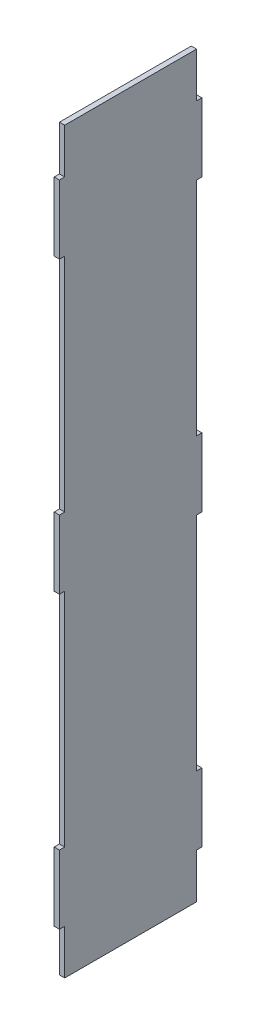
ISO-10303-21;
HEADER;
FILE_DESCRIPTION(('STEP AP214'),'2;1');
FILE_NAME('part.step','',(''),(''),'','','');
FILE_SCHEMA(('AUTOMOTIVE_DESIGN { 1 0 10303 214 1 1 1 1 }'));
ENDSEC;
DATA;
#1=APPLICATION_CONTEXT('core data for automotive mechanical design processes');
#2=APPLICATION_PROTOCOL_DEFINITION('international standard','automotive_design',2000,#1);
#3=PRODUCT_CONTEXT('',#1,'mechanical');
#4=PRODUCT('Part','Part','',(#3));
#5=PRODUCT_RELATED_PRODUCT_CATEGORY('part','',(#4));
#6=PRODUCT_DEFINITION_FORMATION('','',#4);
#7=PRODUCT_DEFINITION_CONTEXT('part definition',#1,'design');
#8=PRODUCT_DEFINITION('design','',#6,#7);
#9=PRODUCT_DEFINITION_SHAPE('','',#8);
#10=(LENGTH_UNIT() NAMED_UNIT(*) SI_UNIT(.MILLI.,.METRE.));
#11=(NAMED_UNIT(*) PLANE_ANGLE_UNIT() SI_UNIT($,.RADIAN.));
#12=(NAMED_UNIT(*) SI_UNIT($,.STERADIAN.) SOLID_ANGLE_UNIT());
#13=UNCERTAINTY_MEASURE_WITH_UNIT(LENGTH_MEASURE(1.E-05),#10,'distance_accuracy_value','');
#14=(GEOMETRIC_REPRESENTATION_CONTEXT(3) GLOBAL_UNCERTAINTY_ASSIGNED_CONTEXT((#13)) GLOBAL_UNIT_ASSIGNED_CONTEXT((#10,
#11,#12)) REPRESENTATION_CONTEXT('',''));
#15=CARTESIAN_POINT('',(0.,0.,0.));
#16=DIRECTION('',(0.,0.,1.));
#17=DIRECTION('',(1.,0.,0.));
#18=AXIS2_PLACEMENT_3D('',#15,#16,#17);
#19=CARTESIAN_POINT('',(1.,61.5,-12.5));
#20=DIRECTION('',(0.,0.,1.));
#21=DIRECTION('',(0.,-1.,0.));
#22=AXIS2_PLACEMENT_3D('',#19,#20,#21);
#23=PLANE('',#22);
#24=DIRECTION('',(0.,1.,0.));
#25=VECTOR('',#24,1.);
#26=CARTESIAN_POINT('',(0.,61.5,-12.5));
#27=LINE('',#26,#25);
#28=CARTESIAN_POINT('',(0.,61.5,-12.5));
#29=VERTEX_POINT('',#28);
#30=CARTESIAN_POINT('',(0.,70.,-12.5));
#31=VERTEX_POINT('',#30);
#32=EDGE_CURVE('E249',#29,#31,#27,.T.);
#33=ORIENTED_EDGE('',*,*,#32,.T.);
#34=DIRECTION('',(-1.,0.,0.));
#35=VECTOR('',#34,1.);
#36=CARTESIAN_POINT('',(1.,70.,-12.5));
#37=LINE('',#36,#35);
#38=CARTESIAN_POINT('',(1.,70.,-12.5));
#39=VERTEX_POINT('',#38);
#40=EDGE_CURVE('E11',#39,#31,#37,.T.);
#41=ORIENTED_EDGE('',*,*,#40,.F.);
#42=DIRECTION('',(0.,1.,0.));
#43=VECTOR('',#42,1.);
#44=CARTESIAN_POINT('',(1.,61.5,-12.5));
#45=LINE('',#44,#43);
#46=CARTESIAN_POINT('',(1.,61.5,-12.5));
#47=VERTEX_POINT('',#46);
#48=EDGE_CURVE('E303',#47,#39,#45,.T.);
#49=ORIENTED_EDGE('',*,*,#48,.F.);
#50=DIRECTION('',(-1.,0.,0.));
#51=VECTOR('',#50,1.);
#52=CARTESIAN_POINT('',(1.,61.5,-12.5));
#53=LINE('',#52,#51);
#54=EDGE_CURVE('E245',#47,#29,#53,.T.);
#55=ORIENTED_EDGE('',*,*,#54,.T.);
#56=EDGE_LOOP('',(#33,#41,#49,#55));
#57=FACE_BOUND('',#56,.T.);
#58=ADVANCED_FACE('F33',(#57),#23,.F.);
#59=CARTESIAN_POINT('',(1.,70.,12.5));
#60=DIRECTION('',(0.,-1.,0.));
#61=DIRECTION('',(0.,0.,-1.));
#62=AXIS2_PLACEMENT_3D('',#59,#60,#61);
#63=PLANE('',#62);
#64=DIRECTION('',(0.,0.,1.));
#65=VECTOR('',#64,1.);
#66=CARTESIAN_POINT('',(0.,70.,12.5));
#67=LINE('',#66,#65);
#68=CARTESIAN_POINT('',(0.,70.,12.5));
#69=VERTEX_POINT('',#68);
#70=EDGE_CURVE('E252',#31,#69,#67,.T.);
#71=ORIENTED_EDGE('',*,*,#70,.T.);
#72=DIRECTION('',(-1.,0.,0.));
#73=VECTOR('',#72,1.);
#74=CARTESIAN_POINT('',(1.,70.,12.5));
#75=LINE('',#74,#73);
#76=CARTESIAN_POINT('',(1.,70.,12.5));
#77=VERTEX_POINT('',#76);
#78=EDGE_CURVE('E41',#77,#69,#75,.T.);
#79=ORIENTED_EDGE('',*,*,#78,.F.);
#80=DIRECTION('',(0.,0.,1.));
#81=VECTOR('',#80,1.);
#82=CARTESIAN_POINT('',(1.,70.,12.5));
#83=LINE('',#82,#81);
#84=EDGE_CURVE('E152',#39,#77,#83,.T.);
#85=ORIENTED_EDGE('',*,*,#84,.F.);
#86=ORIENTED_EDGE('',*,*,#40,.T.);
#87=EDGE_LOOP('',(#71,#79,#85,#86));
#88=FACE_BOUND('',#87,.T.);
#89=ADVANCED_FACE('F461',(#88),#63,.F.);
#90=CARTESIAN_POINT('',(1.,61.5,12.5));
#91=DIRECTION('',(0.,0.,-1.));
#92=DIRECTION('',(-1.,0.,0.));
#93=AXIS2_PLACEMENT_3D('',#90,#91,#92);
#94=PLANE('',#93);
#95=DIRECTION('',(0.,-1.,0.));
#96=VECTOR('',#95,1.);
#97=CARTESIAN_POINT('',(0.,61.5,12.5));
#98=LINE('',#97,#96);
#99=CARTESIAN_POINT('',(0.,61.5,12.5));
#100=VERTEX_POINT('',#99);
#101=EDGE_CURVE('E254',#69,#100,#98,.T.);
#102=ORIENTED_EDGE('',*,*,#101,.T.);
#103=DIRECTION('',(-1.,0.,0.));
#104=VECTOR('',#103,1.);
#105=CARTESIAN_POINT('',(1.,61.5,12.5));
#106=LINE('',#105,#104);
#107=CARTESIAN_POINT('',(1.,61.5,12.5));
#108=VERTEX_POINT('',#107);
#109=EDGE_CURVE('E370',#108,#100,#106,.T.);
#110=ORIENTED_EDGE('',*,*,#109,.F.);
#111=DIRECTION('',(0.,-1.,0.));
#112=VECTOR('',#111,1.);
#113=CARTESIAN_POINT('',(1.,61.5,12.5));
#114=LINE('',#113,#112);
#115=EDGE_CURVE('E378',#77,#108,#114,.T.);
#116=ORIENTED_EDGE('',*,*,#115,.F.);
#117=ORIENTED_EDGE('',*,*,#78,.T.);
#118=EDGE_LOOP('',(#102,#110,#116,#117));
#119=FACE_BOUND('',#118,.T.);
#120=ADVANCED_FACE('F376',(#119),#94,.F.);
#121=CARTESIAN_POINT('',(1.,61.5,12.5));
#122=DIRECTION('',(0.,-1.,0.));
#123=DIRECTION('',(0.,0.,-1.));
#124=AXIS2_PLACEMENT_3D('',#121,#122,#123);
#125=PLANE('',#124);
#126=DIRECTION('',(0.,0.,1.));
#127=VECTOR('',#126,1.);
#128=CARTESIAN_POINT('',(0.,61.5,12.5));
#129=LINE('',#128,#127);
#130=CARTESIAN_POINT('',(0.,61.5,13.5));
#131=VERTEX_POINT('',#130);
#132=EDGE_CURVE('E256',#100,#131,#129,.T.);
#133=ORIENTED_EDGE('',*,*,#132,.T.);
#134=DIRECTION('',(-1.,0.,0.));
#135=VECTOR('',#134,1.);
#136=CARTESIAN_POINT('',(1.,61.5,13.5));
#137=LINE('',#136,#135);
#138=CARTESIAN_POINT('',(1.,61.5,13.5));
#139=VERTEX_POINT('',#138);
#140=EDGE_CURVE('E367',#139,#131,#137,.T.);
#141=ORIENTED_EDGE('',*,*,#140,.F.);
#142=DIRECTION('',(0.,0.,1.));
#143=VECTOR('',#142,1.);
#144=CARTESIAN_POINT('',(1.,61.5,12.5));
#145=LINE('',#144,#143);
#146=EDGE_CURVE('E396',#108,#139,#145,.T.);
#147=ORIENTED_EDGE('',*,*,#146,.F.);
#148=ORIENTED_EDGE('',*,*,#109,.T.);
#149=EDGE_LOOP('',(#133,#141,#147,#148));
#150=FACE_BOUND('',#149,.T.);
#151=ADVANCED_FACE('F387',(#150),#125,.F.);
#152=CARTESIAN_POINT('',(1.,61.5,13.5));
#153=DIRECTION('',(0.,0.,-1.));
#154=DIRECTION('',(-1.,0.,0.));
#155=AXIS2_PLACEMENT_3D('',#152,#153,#154);
#156=PLANE('',#155);
#157=DIRECTION('',(0.,-1.,0.));
#158=VECTOR('',#157,1.);
#159=CARTESIAN_POINT('',(0.,61.5,13.5));
#160=LINE('',#159,#158);
#161=CARTESIAN_POINT('',(0.,48.5,13.5));
#162=VERTEX_POINT('',#161);
#163=EDGE_CURVE('E258',#131,#162,#160,.T.);
#164=ORIENTED_EDGE('',*,*,#163,.T.);
#165=DIRECTION('',(-1.,0.,0.));
#166=VECTOR('',#165,1.);
#167=CARTESIAN_POINT('',(1.,48.5,13.5));
#168=LINE('',#167,#166);
#169=CARTESIAN_POINT('',(1.,48.5,13.5));
#170=VERTEX_POINT('',#169);
#171=EDGE_CURVE('E364',#170,#162,#168,.T.);
#172=ORIENTED_EDGE('',*,*,#171,.F.);
#173=DIRECTION('',(0.,-1.,0.));
#174=VECTOR('',#173,1.);
#175=CARTESIAN_POINT('',(1.,61.5,13.5));
#176=LINE('',#175,#174);
#177=EDGE_CURVE('E393',#139,#170,#176,.T.);
#178=ORIENTED_EDGE('',*,*,#177,.F.);
#179=ORIENTED_EDGE('',*,*,#140,.T.);
#180=EDGE_LOOP('',(#164,#172,#178,#179));
#181=FACE_BOUND('',#180,.T.);
#182=ADVANCED_FACE('F391',(#181),#156,.F.);
#183=CARTESIAN_POINT('',(1.,48.5,13.5));
#184=DIRECTION('',(0.,1.,0.));
#185=DIRECTION('',(0.,0.,1.));
#186=AXIS2_PLACEMENT_3D('',#183,#184,#185);
#187=PLANE('',#186);
#188=DIRECTION('',(0.,0.,-1.));
#189=VECTOR('',#188,1.);
#190=CARTESIAN_POINT('',(0.,48.5,13.5));
#191=LINE('',#190,#189);
#192=CARTESIAN_POINT('',(0.,48.5,12.5));
#193=VERTEX_POINT('',#192);
#194=EDGE_CURVE('E260',#162,#193,#191,.T.);
#195=ORIENTED_EDGE('',*,*,#194,.T.);
#196=DIRECTION('',(-1.,0.,0.));
#197=VECTOR('',#196,1.);
#198=CARTESIAN_POINT('',(1.,48.5,12.5));
#199=LINE('',#198,#197);
#200=CARTESIAN_POINT('',(1.,48.5,12.5));
#201=VERTEX_POINT('',#200);
#202=EDGE_CURVE('E361',#201,#193,#199,.T.);
#203=ORIENTED_EDGE('',*,*,#202,.F.);
#204=DIRECTION('',(0.,0.,-1.));
#205=VECTOR('',#204,1.);
#206=CARTESIAN_POINT('',(1.,48.5,13.5));
#207=LINE('',#206,#205);
#208=EDGE_CURVE('E395',#170,#201,#207,.T.);
#209=ORIENTED_EDGE('',*,*,#208,.F.);
#210=ORIENTED_EDGE('',*,*,#171,.T.);
#211=EDGE_LOOP('',(#195,#203,#209,#210));
#212=FACE_BOUND('',#211,.T.);
#213=ADVANCED_FACE('F474',(#212),#187,.F.);
#214=CARTESIAN_POINT('',(1.,48.5,12.5));
#215=DIRECTION('',(0.,0.,-1.));
#216=DIRECTION('',(-1.,0.,0.));
#217=AXIS2_PLACEMENT_3D('',#214,#215,#216);
#218=PLANE('',#217);
#219=DIRECTION('',(0.,-1.,0.));
#220=VECTOR('',#219,1.);
#221=CARTESIAN_POINT('',(0.,48.5,12.5));
#222=LINE('',#221,#220);
#223=CARTESIAN_POINT('',(0.,6.5,12.5));
#224=VERTEX_POINT('',#223);
#225=EDGE_CURVE('E262',#193,#224,#222,.T.);
#226=ORIENTED_EDGE('',*,*,#225,.T.);
#227=DIRECTION('',(-1.,0.,0.));
#228=VECTOR('',#227,1.);
#229=CARTESIAN_POINT('',(1.,6.5,12.5));
#230=LINE('',#229,#228);
#231=CARTESIAN_POINT('',(1.,6.5,12.5));
#232=VERTEX_POINT('',#231);
#233=EDGE_CURVE('E358',#232,#224,#230,.T.);
#234=ORIENTED_EDGE('',*,*,#233,.F.);
#235=DIRECTION('',(0.,-1.,0.));
#236=VECTOR('',#235,1.);
#237=CARTESIAN_POINT('',(1.,48.5,12.5));
#238=LINE('',#237,#236);
#239=EDGE_CURVE('E398',#201,#232,#238,.T.);
#240=ORIENTED_EDGE('',*,*,#239,.F.);
#241=ORIENTED_EDGE('',*,*,#202,.T.);
#242=EDGE_LOOP('',(#226,#234,#240,#241));
#243=FACE_BOUND('',#242,.T.);
#244=ADVANCED_FACE('F477',(#243),#218,.F.);
#245=CARTESIAN_POINT('',(1.,6.5,12.5));
#246=DIRECTION('',(0.,-1.,0.));
#247=DIRECTION('',(0.,0.,-1.));
#248=AXIS2_PLACEMENT_3D('',#245,#246,#247);
#249=PLANE('',#248);
#250=DIRECTION('',(0.,0.,1.));
#251=VECTOR('',#250,1.);
#252=CARTESIAN_POINT('',(0.,6.5,12.5));
#253=LINE('',#252,#251);
#254=CARTESIAN_POINT('',(0.,6.5,13.5));
#255=VERTEX_POINT('',#254);
#256=EDGE_CURVE('E264',#224,#255,#253,.T.);
#257=ORIENTED_EDGE('',*,*,#256,.T.);
#258=DIRECTION('',(-1.,0.,0.));
#259=VECTOR('',#258,1.);
#260=CARTESIAN_POINT('',(1.,6.5,13.5));
#261=LINE('',#260,#259);
#262=CARTESIAN_POINT('',(1.,6.5,13.5));
#263=VERTEX_POINT('',#262);
#264=EDGE_CURVE('E355',#263,#255,#261,.T.);
#265=ORIENTED_EDGE('',*,*,#264,.F.);
#266=DIRECTION('',(0.,0.,1.));
#267=VECTOR('',#266,1.);
#268=CARTESIAN_POINT('',(1.,6.5,12.5));
#269=LINE('',#268,#267);
#270=EDGE_CURVE('E404',#232,#263,#269,.T.);
#271=ORIENTED_EDGE('',*,*,#270,.F.);
#272=ORIENTED_EDGE('',*,*,#233,.T.);
#273=EDGE_LOOP('',(#257,#265,#271,#272));
#274=FACE_BOUND('',#273,.T.);
#275=ADVANCED_FACE('F481',(#274),#249,.F.);
#276=CARTESIAN_POINT('',(1.,6.5,13.5));
#277=DIRECTION('',(0.,0.,-1.));
#278=DIRECTION('',(-1.,0.,0.));
#279=AXIS2_PLACEMENT_3D('',#276,#277,#278);
#280=PLANE('',#279);
#281=DIRECTION('',(0.,-1.,0.));
#282=VECTOR('',#281,1.);
#283=CARTESIAN_POINT('',(0.,6.5,13.5));
#284=LINE('',#283,#282);
#285=CARTESIAN_POINT('',(0.,-6.5,13.5));
#286=VERTEX_POINT('',#285);
#287=EDGE_CURVE('E266',#255,#286,#284,.T.);
#288=ORIENTED_EDGE('',*,*,#287,.T.);
#289=DIRECTION('',(-1.,0.,0.));
#290=VECTOR('',#289,1.);
#291=CARTESIAN_POINT('',(1.,-6.5,13.5));
#292=LINE('',#291,#290);
#293=CARTESIAN_POINT('',(1.,-6.5,13.5));
#294=VERTEX_POINT('',#293);
#295=EDGE_CURVE('E352',#294,#286,#292,.T.);
#296=ORIENTED_EDGE('',*,*,#295,.F.);
#297=DIRECTION('',(0.,-1.,0.));
#298=VECTOR('',#297,1.);
#299=CARTESIAN_POINT('',(1.,6.5,13.5));
#300=LINE('',#299,#298);
#301=EDGE_CURVE('E406',#263,#294,#300,.T.);
#302=ORIENTED_EDGE('',*,*,#301,.F.);
#303=ORIENTED_EDGE('',*,*,#264,.T.);
#304=EDGE_LOOP('',(#288,#296,#302,#303));
#305=FACE_BOUND('',#304,.T.);
#306=ADVANCED_FACE('F485',(#305),#280,.F.);
#307=CARTESIAN_POINT('',(1.,-6.5,13.5));
#308=DIRECTION('',(0.,1.,0.));
#309=DIRECTION('',(0.,0.,1.));
#310=AXIS2_PLACEMENT_3D('',#307,#308,#309);
#311=PLANE('',#310);
#312=DIRECTION('',(0.,0.,-1.));
#313=VECTOR('',#312,1.);
#314=CARTESIAN_POINT('',(0.,-6.5,13.5));
#315=LINE('',#314,#313);
#316=CARTESIAN_POINT('',(0.,-6.5,12.5));
#317=VERTEX_POINT('',#316);
#318=EDGE_CURVE('E268',#286,#317,#315,.T.);
#319=ORIENTED_EDGE('',*,*,#318,.T.);
#320=DIRECTION('',(-1.,0.,0.));
#321=VECTOR('',#320,1.);
#322=CARTESIAN_POINT('',(1.,-6.5,12.5));
#323=LINE('',#322,#321);
#324=CARTESIAN_POINT('',(1.,-6.5,12.5));
#325=VERTEX_POINT('',#324);
#326=EDGE_CURVE('E349',#325,#317,#323,.T.);
#327=ORIENTED_EDGE('',*,*,#326,.F.);
#328=DIRECTION('',(0.,0.,-1.));
#329=VECTOR('',#328,1.);
#330=CARTESIAN_POINT('',(1.,-6.5,13.5));
#331=LINE('',#330,#329);
#332=EDGE_CURVE('E408',#294,#325,#331,.T.);
#333=ORIENTED_EDGE('',*,*,#332,.F.);
#334=ORIENTED_EDGE('',*,*,#295,.T.);
#335=EDGE_LOOP('',(#319,#327,#333,#334));
#336=FACE_BOUND('',#335,.T.);
#337=ADVANCED_FACE('F489',(#336),#311,.F.);
#338=CARTESIAN_POINT('',(1.,-6.5,12.5));
#339=DIRECTION('',(0.,0.,-1.));
#340=DIRECTION('',(-1.,0.,0.));
#341=AXIS2_PLACEMENT_3D('',#338,#339,#340);
#342=PLANE('',#341);
#343=DIRECTION('',(0.,-1.,0.));
#344=VECTOR('',#343,1.);
#345=CARTESIAN_POINT('',(0.,-6.5,12.5));
#346=LINE('',#345,#344);
#347=CARTESIAN_POINT('',(0.,-48.5,12.5));
#348=VERTEX_POINT('',#347);
#349=EDGE_CURVE('E270',#317,#348,#346,.T.);
#350=ORIENTED_EDGE('',*,*,#349,.T.);
#351=DIRECTION('',(-1.,0.,0.));
#352=VECTOR('',#351,1.);
#353=CARTESIAN_POINT('',(1.,-48.5,12.5));
#354=LINE('',#353,#352);
#355=CARTESIAN_POINT('',(1.,-48.5,12.5));
#356=VERTEX_POINT('',#355);
#357=EDGE_CURVE('E346',#356,#348,#354,.T.);
#358=ORIENTED_EDGE('',*,*,#357,.F.);
#359=DIRECTION('',(0.,-1.,0.));
#360=VECTOR('',#359,1.);
#361=CARTESIAN_POINT('',(1.,-6.5,12.5));
#362=LINE('',#361,#360);
#363=EDGE_CURVE('E410',#325,#356,#362,.T.);
#364=ORIENTED_EDGE('',*,*,#363,.F.);
#365=ORIENTED_EDGE('',*,*,#326,.T.);
#366=EDGE_LOOP('',(#350,#358,#364,#365));
#367=FACE_BOUND('',#366,.T.);
#368=ADVANCED_FACE('F493',(#367),#342,.F.);
#369=CARTESIAN_POINT('',(1.,-48.5,12.5));
#370=DIRECTION('',(0.,-1.,0.));
#371=DIRECTION('',(0.,0.,-1.));
#372=AXIS2_PLACEMENT_3D('',#369,#370,#371);
#373=PLANE('',#372);
#374=DIRECTION('',(0.,0.,1.));
#375=VECTOR('',#374,1.);
#376=CARTESIAN_POINT('',(0.,-48.5,12.5));
#377=LINE('',#376,#375);
#378=CARTESIAN_POINT('',(0.,-48.5,13.5));
#379=VERTEX_POINT('',#378);
#380=EDGE_CURVE('E272',#348,#379,#377,.T.);
#381=ORIENTED_EDGE('',*,*,#380,.T.);
#382=DIRECTION('',(-1.,0.,0.));
#383=VECTOR('',#382,1.);
#384=CARTESIAN_POINT('',(1.,-48.5,13.5));
#385=LINE('',#384,#383);
#386=CARTESIAN_POINT('',(1.,-48.5,13.5));
#387=VERTEX_POINT('',#386);
#388=EDGE_CURVE('E343',#387,#379,#385,.T.);
#389=ORIENTED_EDGE('',*,*,#388,.F.);
#390=DIRECTION('',(0.,0.,1.));
#391=VECTOR('',#390,1.);
#392=CARTESIAN_POINT('',(1.,-48.5,12.5));
#393=LINE('',#392,#391);
#394=EDGE_CURVE('E412',#356,#387,#393,.T.);
#395=ORIENTED_EDGE('',*,*,#394,.F.);
#396=ORIENTED_EDGE('',*,*,#357,.T.);
#397=EDGE_LOOP('',(#381,#389,#395,#396));
#398=FACE_BOUND('',#397,.T.);
#399=ADVANCED_FACE('F497',(#398),#373,.F.);
#400=CARTESIAN_POINT('',(1.,-48.5,13.5));
#401=DIRECTION('',(0.,0.,-1.));
#402=DIRECTION('',(-1.,0.,0.));
#403=AXIS2_PLACEMENT_3D('',#400,#401,#402);
#404=PLANE('',#403);
#405=DIRECTION('',(0.,-1.,0.));
#406=VECTOR('',#405,1.);
#407=CARTESIAN_POINT('',(0.,-48.5,13.5));
#408=LINE('',#407,#406);
#409=CARTESIAN_POINT('',(0.,-61.5,13.5));
#410=VERTEX_POINT('',#409);
#411=EDGE_CURVE('E274',#379,#410,#408,.T.);
#412=ORIENTED_EDGE('',*,*,#411,.T.);
#413=DIRECTION('',(-1.,0.,0.));
#414=VECTOR('',#413,1.);
#415=CARTESIAN_POINT('',(1.,-61.5,13.5));
#416=LINE('',#415,#414);
#417=CARTESIAN_POINT('',(1.,-61.5,13.5));
#418=VERTEX_POINT('',#417);
#419=EDGE_CURVE('E340',#418,#410,#416,.T.);
#420=ORIENTED_EDGE('',*,*,#419,.F.);
#421=DIRECTION('',(0.,-1.,0.));
#422=VECTOR('',#421,1.);
#423=CARTESIAN_POINT('',(1.,-48.5,13.5));
#424=LINE('',#423,#422);
#425=EDGE_CURVE('E414',#387,#418,#424,.T.);
#426=ORIENTED_EDGE('',*,*,#425,.F.);
#427=ORIENTED_EDGE('',*,*,#388,.T.);
#428=EDGE_LOOP('',(#412,#420,#426,#427));
#429=FACE_BOUND('',#428,.T.);
#430=ADVANCED_FACE('F501',(#429),#404,.F.);
#431=CARTESIAN_POINT('',(1.,-61.5,13.5));
#432=DIRECTION('',(0.,1.,0.));
#433=DIRECTION('',(0.,0.,1.));
#434=AXIS2_PLACEMENT_3D('',#431,#432,#433);
#435=PLANE('',#434);
#436=DIRECTION('',(0.,0.,-1.));
#437=VECTOR('',#436,1.);
#438=CARTESIAN_POINT('',(0.,-61.5,13.5));
#439=LINE('',#438,#437);
#440=CARTESIAN_POINT('',(0.,-61.5,12.5));
#441=VERTEX_POINT('',#440);
#442=EDGE_CURVE('E276',#410,#441,#439,.T.);
#443=ORIENTED_EDGE('',*,*,#442,.T.);
#444=DIRECTION('',(-1.,0.,0.));
#445=VECTOR('',#444,1.);
#446=CARTESIAN_POINT('',(1.,-61.5,12.5));
#447=LINE('',#446,#445);
#448=CARTESIAN_POINT('',(1.,-61.5,12.5));
#449=VERTEX_POINT('',#448);
#450=EDGE_CURVE('E337',#449,#441,#447,.T.);
#451=ORIENTED_EDGE('',*,*,#450,.F.);
#452=DIRECTION('',(0.,0.,-1.));
#453=VECTOR('',#452,1.);
#454=CARTESIAN_POINT('',(1.,-61.5,13.5));
#455=LINE('',#454,#453);
#456=EDGE_CURVE('E416',#418,#449,#455,.T.);
#457=ORIENTED_EDGE('',*,*,#456,.F.);
#458=ORIENTED_EDGE('',*,*,#419,.T.);
#459=EDGE_LOOP('',(#443,#451,#457,#458));
#460=FACE_BOUND('',#459,.T.);
#461=ADVANCED_FACE('F505',(#460),#435,.F.);
#462=CARTESIAN_POINT('',(1.,-61.5,12.5));
#463=DIRECTION('',(0.,0.,-1.));
#464=DIRECTION('',(-1.,0.,0.));
#465=AXIS2_PLACEMENT_3D('',#462,#463,#464);
#466=PLANE('',#465);
#467=DIRECTION('',(0.,-1.,0.));
#468=VECTOR('',#467,1.);
#469=CARTESIAN_POINT('',(0.,-61.5,12.5));
#470=LINE('',#469,#468);
#471=CARTESIAN_POINT('',(0.,-70.,12.5));
#472=VERTEX_POINT('',#471);
#473=EDGE_CURVE('E278',#441,#472,#470,.T.);
#474=ORIENTED_EDGE('',*,*,#473,.T.);
#475=DIRECTION('',(-1.,0.,0.));
#476=VECTOR('',#475,1.);
#477=CARTESIAN_POINT('',(1.,-70.,12.5));
#478=LINE('',#477,#476);
#479=CARTESIAN_POINT('',(1.,-70.,12.5));
#480=VERTEX_POINT('',#479);
#481=EDGE_CURVE('E334',#480,#472,#478,.T.);
#482=ORIENTED_EDGE('',*,*,#481,.F.);
#483=DIRECTION('',(0.,-1.,0.));
#484=VECTOR('',#483,1.);
#485=CARTESIAN_POINT('',(1.,-61.5,12.5));
#486=LINE('',#485,#484);
#487=EDGE_CURVE('E418',#449,#480,#486,.T.);
#488=ORIENTED_EDGE('',*,*,#487,.F.);
#489=ORIENTED_EDGE('',*,*,#450,.T.);
#490=EDGE_LOOP('',(#474,#482,#488,#489));
#491=FACE_BOUND('',#490,.T.);
#492=ADVANCED_FACE('F509',(#491),#466,.F.);
#493=CARTESIAN_POINT('',(1.,-70.,12.5));
#494=DIRECTION('',(0.,1.,0.));
#495=DIRECTION('',(0.,0.,1.));
#496=AXIS2_PLACEMENT_3D('',#493,#494,#495);
#497=PLANE('',#496);
#498=DIRECTION('',(0.,0.,-1.));
#499=VECTOR('',#498,1.);
#500=CARTESIAN_POINT('',(0.,-70.,12.5));
#501=LINE('',#500,#499);
#502=CARTESIAN_POINT('',(0.,-70.,-12.5));
#503=VERTEX_POINT('',#502);
#504=EDGE_CURVE('E280',#472,#503,#501,.T.);
#505=ORIENTED_EDGE('',*,*,#504,.T.);
#506=DIRECTION('',(-1.,0.,0.));
#507=VECTOR('',#506,1.);
#508=CARTESIAN_POINT('',(1.,-70.,-12.5));
#509=LINE('',#508,#507);
#510=CARTESIAN_POINT('',(1.,-70.,-12.5));
#511=VERTEX_POINT('',#510);
#512=EDGE_CURVE('E331',#511,#503,#509,.T.);
#513=ORIENTED_EDGE('',*,*,#512,.F.);
#514=DIRECTION('',(0.,0.,-1.));
#515=VECTOR('',#514,1.);
#516=CARTESIAN_POINT('',(1.,-70.,12.5));
#517=LINE('',#516,#515);
#518=EDGE_CURVE('E420',#480,#511,#517,.T.);
#519=ORIENTED_EDGE('',*,*,#518,.F.);
#520=ORIENTED_EDGE('',*,*,#481,.T.);
#521=EDGE_LOOP('',(#505,#513,#519,#520));
#522=FACE_BOUND('',#521,.T.);
#523=ADVANCED_FACE('F513',(#522),#497,.F.);
#524=CARTESIAN_POINT('',(1.,-61.5,-12.5));
#525=DIRECTION('',(0.,0.,1.));
#526=DIRECTION('',(0.,-1.,0.));
#527=AXIS2_PLACEMENT_3D('',#524,#525,#526);
#528=PLANE('',#527);
#529=DIRECTION('',(0.,1.,0.));
#530=VECTOR('',#529,1.);
#531=CARTESIAN_POINT('',(0.,-61.5,-12.5));
#532=LINE('',#531,#530);
#533=CARTESIAN_POINT('',(0.,-61.5,-12.5));
#534=VERTEX_POINT('',#533);
#535=EDGE_CURVE('E282',#503,#534,#532,.T.);
#536=ORIENTED_EDGE('',*,*,#535,.T.);
#537=DIRECTION('',(-1.,0.,0.));
#538=VECTOR('',#537,1.);
#539=CARTESIAN_POINT('',(1.,-61.5,-12.5));
#540=LINE('',#539,#538);
#541=CARTESIAN_POINT('',(1.,-61.5,-12.5));
#542=VERTEX_POINT('',#541);
#543=EDGE_CURVE('E328',#542,#534,#540,.T.);
#544=ORIENTED_EDGE('',*,*,#543,.F.);
#545=DIRECTION('',(0.,1.,0.));
#546=VECTOR('',#545,1.);
#547=CARTESIAN_POINT('',(1.,-61.5,-12.5));
#548=LINE('',#547,#546);
#549=EDGE_CURVE('E422',#511,#542,#548,.T.);
#550=ORIENTED_EDGE('',*,*,#549,.F.);
#551=ORIENTED_EDGE('',*,*,#512,.T.);
#552=EDGE_LOOP('',(#536,#544,#550,#551));
#553=FACE_BOUND('',#552,.T.);
#554=ADVANCED_FACE('F517',(#553),#528,.F.);
#555=CARTESIAN_POINT('',(1.,-61.5,-13.5));
#556=DIRECTION('',(0.,1.,0.));
#557=DIRECTION('',(0.,0.,1.));
#558=AXIS2_PLACEMENT_3D('',#555,#556,#557);
#559=PLANE('',#558);
#560=DIRECTION('',(0.,0.,-1.));
#561=VECTOR('',#560,1.);
#562=CARTESIAN_POINT('',(0.,-61.5,-13.5));
#563=LINE('',#562,#561);
#564=CARTESIAN_POINT('',(0.,-61.5,-13.5));
#565=VERTEX_POINT('',#564);
#566=EDGE_CURVE('E284',#534,#565,#563,.T.);
#567=ORIENTED_EDGE('',*,*,#566,.T.);
#568=DIRECTION('',(-1.,0.,0.));
#569=VECTOR('',#568,1.);
#570=CARTESIAN_POINT('',(1.,-61.5,-13.5));
#571=LINE('',#570,#569);
#572=CARTESIAN_POINT('',(1.,-61.5,-13.5));
#573=VERTEX_POINT('',#572);
#574=EDGE_CURVE('E325',#573,#565,#571,.T.);
#575=ORIENTED_EDGE('',*,*,#574,.F.);
#576=DIRECTION('',(0.,0.,-1.));
#577=VECTOR('',#576,1.);
#578=CARTESIAN_POINT('',(1.,-61.5,-13.5));
#579=LINE('',#578,#577);
#580=EDGE_CURVE('E424',#542,#573,#579,.T.);
#581=ORIENTED_EDGE('',*,*,#580,.F.);
#582=ORIENTED_EDGE('',*,*,#543,.T.);
#583=EDGE_LOOP('',(#567,#575,#581,#582));
#584=FACE_BOUND('',#583,.T.);
#585=ADVANCED_FACE('F521',(#584),#559,.F.);
#586=CARTESIAN_POINT('',(1.,-48.5,-13.5));
#587=DIRECTION('',(0.,0.,1.));
#588=DIRECTION('',(1.,0.,0.));
#589=AXIS2_PLACEMENT_3D('',#586,#587,#588);
#590=PLANE('',#589);
#591=DIRECTION('',(0.,1.,0.));
#592=VECTOR('',#591,1.);
#593=CARTESIAN_POINT('',(0.,-48.5,-13.5));
#594=LINE('',#593,#592);
#595=CARTESIAN_POINT('',(0.,-48.5,-13.5));
#596=VERTEX_POINT('',#595);
#597=EDGE_CURVE('E286',#565,#596,#594,.T.);
#598=ORIENTED_EDGE('',*,*,#597,.T.);
#599=DIRECTION('',(-1.,0.,0.));
#600=VECTOR('',#599,1.);
#601=CARTESIAN_POINT('',(1.,-48.5,-13.5));
#602=LINE('',#601,#600);
#603=CARTESIAN_POINT('',(1.,-48.5,-13.5));
#604=VERTEX_POINT('',#603);
#605=EDGE_CURVE('E322',#604,#596,#602,.T.);
#606=ORIENTED_EDGE('',*,*,#605,.F.);
#607=DIRECTION('',(0.,1.,0.));
#608=VECTOR('',#607,1.);
#609=CARTESIAN_POINT('',(1.,-48.5,-13.5));
#610=LINE('',#609,#608);
#611=EDGE_CURVE('E426',#573,#604,#610,.T.);
#612=ORIENTED_EDGE('',*,*,#611,.F.);
#613=ORIENTED_EDGE('',*,*,#574,.T.);
#614=EDGE_LOOP('',(#598,#606,#612,#613));
#615=FACE_BOUND('',#614,.T.);
#616=ADVANCED_FACE('F525',(#615),#590,.F.);
#617=CARTESIAN_POINT('',(1.,-48.5,-12.5));
#618=DIRECTION('',(0.,-1.,0.));
#619=DIRECTION('',(0.,0.,-1.));
#620=AXIS2_PLACEMENT_3D('',#617,#618,#619);
#621=PLANE('',#620);
#622=DIRECTION('',(0.,0.,1.));
#623=VECTOR('',#622,1.);
#624=CARTESIAN_POINT('',(0.,-48.5,-12.5));
#625=LINE('',#624,#623);
#626=CARTESIAN_POINT('',(0.,-48.5,-12.5));
#627=VERTEX_POINT('',#626);
#628=EDGE_CURVE('E288',#596,#627,#625,.T.);
#629=ORIENTED_EDGE('',*,*,#628,.T.);
#630=DIRECTION('',(-1.,0.,0.));
#631=VECTOR('',#630,1.);
#632=CARTESIAN_POINT('',(1.,-48.5,-12.5));
#633=LINE('',#632,#631);
#634=CARTESIAN_POINT('',(1.,-48.5,-12.5));
#635=VERTEX_POINT('',#634);
#636=EDGE_CURVE('E319',#635,#627,#633,.T.);
#637=ORIENTED_EDGE('',*,*,#636,.F.);
#638=DIRECTION('',(0.,0.,1.));
#639=VECTOR('',#638,1.);
#640=CARTESIAN_POINT('',(1.,-48.5,-12.5));
#641=LINE('',#640,#639);
#642=EDGE_CURVE('E428',#604,#635,#641,.T.);
#643=ORIENTED_EDGE('',*,*,#642,.F.);
#644=ORIENTED_EDGE('',*,*,#605,.T.);
#645=EDGE_LOOP('',(#629,#637,#643,#644));
#646=FACE_BOUND('',#645,.T.);
#647=ADVANCED_FACE('F529',(#646),#621,.F.);
#648=CARTESIAN_POINT('',(1.,-6.5,-12.5));
#649=DIRECTION('',(0.,0.,1.));
#650=DIRECTION('',(0.,-1.,0.));
#651=AXIS2_PLACEMENT_3D('',#648,#649,#650);
#652=PLANE('',#651);
#653=DIRECTION('',(0.,1.,0.));
#654=VECTOR('',#653,1.);
#655=CARTESIAN_POINT('',(0.,-6.5,-12.5));
#656=LINE('',#655,#654);
#657=CARTESIAN_POINT('',(0.,-6.5,-12.5));
#658=VERTEX_POINT('',#657);
#659=EDGE_CURVE('E290',#627,#658,#656,.T.);
#660=ORIENTED_EDGE('',*,*,#659,.T.);
#661=DIRECTION('',(-1.,0.,0.));
#662=VECTOR('',#661,1.);
#663=CARTESIAN_POINT('',(1.,-6.5,-12.5));
#664=LINE('',#663,#662);
#665=CARTESIAN_POINT('',(1.,-6.5,-12.5));
#666=VERTEX_POINT('',#665);
#667=EDGE_CURVE('E316',#666,#658,#664,.T.);
#668=ORIENTED_EDGE('',*,*,#667,.F.);
#669=DIRECTION('',(0.,1.,0.));
#670=VECTOR('',#669,1.);
#671=CARTESIAN_POINT('',(1.,-6.5,-12.5));
#672=LINE('',#671,#670);
#673=EDGE_CURVE('E430',#635,#666,#672,.T.);
#674=ORIENTED_EDGE('',*,*,#673,.F.);
#675=ORIENTED_EDGE('',*,*,#636,.T.);
#676=EDGE_LOOP('',(#660,#668,#674,#675));
#677=FACE_BOUND('',#676,.T.);
#678=ADVANCED_FACE('F533',(#677),#652,.F.);
#679=CARTESIAN_POINT('',(1.,-6.5,-13.5));
#680=DIRECTION('',(0.,1.,0.));
#681=DIRECTION('',(0.,0.,1.));
#682=AXIS2_PLACEMENT_3D('',#679,#680,#681);
#683=PLANE('',#682);
#684=DIRECTION('',(0.,0.,-1.));
#685=VECTOR('',#684,1.);
#686=CARTESIAN_POINT('',(0.,-6.5,-13.5));
#687=LINE('',#686,#685);
#688=CARTESIAN_POINT('',(0.,-6.5,-13.5));
#689=VERTEX_POINT('',#688);
#690=EDGE_CURVE('E292',#658,#689,#687,.T.);
#691=ORIENTED_EDGE('',*,*,#690,.T.);
#692=DIRECTION('',(-1.,0.,0.));
#693=VECTOR('',#692,1.);
#694=CARTESIAN_POINT('',(1.,-6.5,-13.5));
#695=LINE('',#694,#693);
#696=CARTESIAN_POINT('',(1.,-6.5,-13.5));
#697=VERTEX_POINT('',#696);
#698=EDGE_CURVE('E313',#697,#689,#695,.T.);
#699=ORIENTED_EDGE('',*,*,#698,.F.);
#700=DIRECTION('',(0.,0.,-1.));
#701=VECTOR('',#700,1.);
#702=CARTESIAN_POINT('',(1.,-6.5,-13.5));
#703=LINE('',#702,#701);
#704=EDGE_CURVE('E432',#666,#697,#703,.T.);
#705=ORIENTED_EDGE('',*,*,#704,.F.);
#706=ORIENTED_EDGE('',*,*,#667,.T.);
#707=EDGE_LOOP('',(#691,#699,#705,#706));
#708=FACE_BOUND('',#707,.T.);
#709=ADVANCED_FACE('F537',(#708),#683,.F.);
#710=CARTESIAN_POINT('',(1.,6.5,-13.5));
#711=DIRECTION('',(0.,0.,1.));
#712=DIRECTION('',(1.,0.,0.));
#713=AXIS2_PLACEMENT_3D('',#710,#711,#712);
#714=PLANE('',#713);
#715=DIRECTION('',(0.,1.,0.));
#716=VECTOR('',#715,1.);
#717=CARTESIAN_POINT('',(0.,6.5,-13.5));
#718=LINE('',#717,#716);
#719=CARTESIAN_POINT('',(0.,6.5,-13.5));
#720=VERTEX_POINT('',#719);
#721=EDGE_CURVE('E294',#689,#720,#718,.T.);
#722=ORIENTED_EDGE('',*,*,#721,.T.);
#723=DIRECTION('',(-1.,0.,0.));
#724=VECTOR('',#723,1.);
#725=CARTESIAN_POINT('',(1.,6.5,-13.5));
#726=LINE('',#725,#724);
#727=CARTESIAN_POINT('',(1.,6.5,-13.5));
#728=VERTEX_POINT('',#727);
#729=EDGE_CURVE('E310',#728,#720,#726,.T.);
#730=ORIENTED_EDGE('',*,*,#729,.F.);
#731=DIRECTION('',(0.,1.,0.));
#732=VECTOR('',#731,1.);
#733=CARTESIAN_POINT('',(1.,6.5,-13.5));
#734=LINE('',#733,#732);
#735=EDGE_CURVE('E434',#697,#728,#734,.T.);
#736=ORIENTED_EDGE('',*,*,#735,.F.);
#737=ORIENTED_EDGE('',*,*,#698,.T.);
#738=EDGE_LOOP('',(#722,#730,#736,#737));
#739=FACE_BOUND('',#738,.T.);
#740=ADVANCED_FACE('F541',(#739),#714,.F.);
#741=CARTESIAN_POINT('',(1.,6.5,-12.5));
#742=DIRECTION('',(0.,-1.,0.));
#743=DIRECTION('',(0.,0.,-1.));
#744=AXIS2_PLACEMENT_3D('',#741,#742,#743);
#745=PLANE('',#744);
#746=DIRECTION('',(0.,0.,1.));
#747=VECTOR('',#746,1.);
#748=CARTESIAN_POINT('',(0.,6.5,-12.5));
#749=LINE('',#748,#747);
#750=CARTESIAN_POINT('',(0.,6.5,-12.5));
#751=VERTEX_POINT('',#750);
#752=EDGE_CURVE('E296',#720,#751,#749,.T.);
#753=ORIENTED_EDGE('',*,*,#752,.T.);
#754=DIRECTION('',(-1.,0.,0.));
#755=VECTOR('',#754,1.);
#756=CARTESIAN_POINT('',(1.,6.5,-12.5));
#757=LINE('',#756,#755);
#758=CARTESIAN_POINT('',(1.,6.5,-12.5));
#759=VERTEX_POINT('',#758);
#760=EDGE_CURVE('E307',#759,#751,#757,.T.);
#761=ORIENTED_EDGE('',*,*,#760,.F.);
#762=DIRECTION('',(0.,0.,1.));
#763=VECTOR('',#762,1.);
#764=CARTESIAN_POINT('',(1.,6.5,-12.5));
#765=LINE('',#764,#763);
#766=EDGE_CURVE('E436',#728,#759,#765,.T.);
#767=ORIENTED_EDGE('',*,*,#766,.F.);
#768=ORIENTED_EDGE('',*,*,#729,.T.);
#769=EDGE_LOOP('',(#753,#761,#767,#768));
#770=FACE_BOUND('',#769,.T.);
#771=ADVANCED_FACE('F442',(#770),#745,.F.);
#772=CARTESIAN_POINT('',(1.,48.5,-12.5));
#773=DIRECTION('',(0.,0.,1.));
#774=DIRECTION('',(0.,-1.,0.));
#775=AXIS2_PLACEMENT_3D('',#772,#773,#774);
#776=PLANE('',#775);
#777=DIRECTION('',(0.,1.,0.));
#778=VECTOR('',#777,1.);
#779=CARTESIAN_POINT('',(0.,48.5,-12.5));
#780=LINE('',#779,#778);
#781=CARTESIAN_POINT('',(0.,48.5,-12.5));
#782=VERTEX_POINT('',#781);
#783=EDGE_CURVE('E298',#751,#782,#780,.T.);
#784=ORIENTED_EDGE('',*,*,#783,.T.);
#785=DIRECTION('',(-1.,0.,0.));
#786=VECTOR('',#785,1.);
#787=CARTESIAN_POINT('',(1.,48.5,-12.5));
#788=LINE('',#787,#786);
#789=CARTESIAN_POINT('',(1.,48.5,-12.5));
#790=VERTEX_POINT('',#789);
#791=EDGE_CURVE('E240',#790,#782,#788,.T.);
#792=ORIENTED_EDGE('',*,*,#791,.F.);
#793=DIRECTION('',(0.,1.,0.));
#794=VECTOR('',#793,1.);
#795=CARTESIAN_POINT('',(1.,48.5,-12.5));
#796=LINE('',#795,#794);
#797=EDGE_CURVE('E231',#759,#790,#796,.T.);
#798=ORIENTED_EDGE('',*,*,#797,.F.);
#799=ORIENTED_EDGE('',*,*,#760,.T.);
#800=EDGE_LOOP('',(#784,#792,#798,#799));
#801=FACE_BOUND('',#800,.T.);
#802=ADVANCED_FACE('F446',(#801),#776,.F.);
#803=CARTESIAN_POINT('',(1.,48.5,-13.5));
#804=DIRECTION('',(0.,1.,0.));
#805=DIRECTION('',(0.,0.,1.));
#806=AXIS2_PLACEMENT_3D('',#803,#804,#805);
#807=PLANE('',#806);
#808=DIRECTION('',(0.,0.,-1.));
#809=VECTOR('',#808,1.);
#810=CARTESIAN_POINT('',(0.,48.5,-13.5));
#811=LINE('',#810,#809);
#812=CARTESIAN_POINT('',(0.,48.5,-13.5));
#813=VERTEX_POINT('',#812);
#814=EDGE_CURVE('E239',#782,#813,#811,.T.);
#815=ORIENTED_EDGE('',*,*,#814,.T.);
#816=DIRECTION('',(-1.,0.,0.));
#817=VECTOR('',#816,1.);
#818=CARTESIAN_POINT('',(1.,48.5,-13.5));
#819=LINE('',#818,#817);
#820=CARTESIAN_POINT('',(1.,48.5,-13.5));
#821=VERTEX_POINT('',#820);
#822=EDGE_CURVE('E236',#821,#813,#819,.T.);
#823=ORIENTED_EDGE('',*,*,#822,.F.);
#824=DIRECTION('',(0.,0.,-1.));
#825=VECTOR('',#824,1.);
#826=CARTESIAN_POINT('',(1.,48.5,-13.5));
#827=LINE('',#826,#825);
#828=EDGE_CURVE('E225',#790,#821,#827,.T.);
#829=ORIENTED_EDGE('',*,*,#828,.F.);
#830=ORIENTED_EDGE('',*,*,#791,.T.);
#831=EDGE_LOOP('',(#815,#823,#829,#830));
#832=FACE_BOUND('',#831,.T.);
#833=ADVANCED_FACE('F237',(#832),#807,.F.);
#834=CARTESIAN_POINT('',(1.,61.5,-13.5));
#835=DIRECTION('',(0.,0.,1.));
#836=DIRECTION('',(1.,0.,0.));
#837=AXIS2_PLACEMENT_3D('',#834,#835,#836);
#838=PLANE('',#837);
#839=DIRECTION('',(0.,1.,0.));
#840=VECTOR('',#839,1.);
#841=CARTESIAN_POINT('',(0.,61.5,-13.5));
#842=LINE('',#841,#840);
#843=CARTESIAN_POINT('',(0.,61.5,-13.5));
#844=VERTEX_POINT('',#843);
#845=EDGE_CURVE('E138',#813,#844,#842,.T.);
#846=ORIENTED_EDGE('',*,*,#845,.T.);
#847=DIRECTION('',(-1.,0.,0.));
#848=VECTOR('',#847,1.);
#849=CARTESIAN_POINT('',(1.,61.5,-13.5));
#850=LINE('',#849,#848);
#851=CARTESIAN_POINT('',(1.,61.5,-13.5));
#852=VERTEX_POINT('',#851);
#853=EDGE_CURVE('E241',#852,#844,#850,.T.);
#854=ORIENTED_EDGE('',*,*,#853,.F.);
#855=DIRECTION('',(0.,1.,0.));
#856=VECTOR('',#855,1.);
#857=CARTESIAN_POINT('',(1.,61.5,-13.5));
#858=LINE('',#857,#856);
#859=EDGE_CURVE('E229',#821,#852,#858,.T.);
#860=ORIENTED_EDGE('',*,*,#859,.F.);
#861=ORIENTED_EDGE('',*,*,#822,.T.);
#862=EDGE_LOOP('',(#846,#854,#860,#861));
#863=FACE_BOUND('',#862,.T.);
#864=ADVANCED_FACE('F243',(#863),#838,.F.);
#865=CARTESIAN_POINT('',(1.,61.5,-12.5));
#866=DIRECTION('',(0.,-1.,0.));
#867=DIRECTION('',(0.,0.,-1.));
#868=AXIS2_PLACEMENT_3D('',#865,#866,#867);
#869=PLANE('',#868);
#870=DIRECTION('',(0.,0.,1.));
#871=VECTOR('',#870,1.);
#872=CARTESIAN_POINT('',(0.,61.5,-12.5));
#873=LINE('',#872,#871);
#874=EDGE_CURVE('E144',#844,#29,#873,.T.);
#875=ORIENTED_EDGE('',*,*,#874,.T.);
#876=ORIENTED_EDGE('',*,*,#54,.F.);
#877=DIRECTION('',(0.,0.,1.));
#878=VECTOR('',#877,1.);
#879=CARTESIAN_POINT('',(1.,61.5,-12.5));
#880=LINE('',#879,#878);
#881=EDGE_CURVE('E49',#852,#47,#880,.T.);
#882=ORIENTED_EDGE('',*,*,#881,.F.);
#883=ORIENTED_EDGE('',*,*,#853,.T.);
#884=EDGE_LOOP('',(#875,#876,#882,#883));
#885=FACE_BOUND('',#884,.T.);
#886=ADVANCED_FACE('F450',(#885),#869,.F.);
#887=CARTESIAN_POINT('',(1.,0.,0.));
#888=DIRECTION('',(-1.,0.,0.));
#889=DIRECTION('',(0.,0.,1.));
#890=AXIS2_PLACEMENT_3D('',#887,#888,#889);
#891=PLANE('',#890);
#892=ORIENTED_EDGE('',*,*,#48,.T.);
#893=ORIENTED_EDGE('',*,*,#84,.T.);
#894=ORIENTED_EDGE('',*,*,#115,.T.);
#895=ORIENTED_EDGE('',*,*,#146,.T.);
#896=ORIENTED_EDGE('',*,*,#177,.T.);
#897=ORIENTED_EDGE('',*,*,#208,.T.);
#898=ORIENTED_EDGE('',*,*,#239,.T.);
#899=ORIENTED_EDGE('',*,*,#270,.T.);
#900=ORIENTED_EDGE('',*,*,#301,.T.);
#901=ORIENTED_EDGE('',*,*,#332,.T.);
#902=ORIENTED_EDGE('',*,*,#363,.T.);
#903=ORIENTED_EDGE('',*,*,#394,.T.);
#904=ORIENTED_EDGE('',*,*,#425,.T.);
#905=ORIENTED_EDGE('',*,*,#456,.T.);
#906=ORIENTED_EDGE('',*,*,#487,.T.);
#907=ORIENTED_EDGE('',*,*,#518,.T.);
#908=ORIENTED_EDGE('',*,*,#549,.T.);
#909=ORIENTED_EDGE('',*,*,#580,.T.);
#910=ORIENTED_EDGE('',*,*,#611,.T.);
#911=ORIENTED_EDGE('',*,*,#642,.T.);
#912=ORIENTED_EDGE('',*,*,#673,.T.);
#913=ORIENTED_EDGE('',*,*,#704,.T.);
#914=ORIENTED_EDGE('',*,*,#735,.T.);
#915=ORIENTED_EDGE('',*,*,#766,.T.);
#916=ORIENTED_EDGE('',*,*,#797,.T.);
#917=ORIENTED_EDGE('',*,*,#828,.T.);
#918=ORIENTED_EDGE('',*,*,#859,.T.);
#919=ORIENTED_EDGE('',*,*,#881,.T.);
#920=EDGE_LOOP('',(#892,#893,#894,#895,#896,#897,#898,#899,#900,#901,#902,#903,#904,#905,#906,
#907,#908,#909,#910,#911,#912,#913,#914,#915,#916,#917,#918,#919));
#921=FACE_BOUND('',#920,.T.);
#922=ADVANCED_FACE('F227',(#921),#891,.F.);
#923=CARTESIAN_POINT('',(0.,0.,0.));
#924=DIRECTION('',(-1.,0.,0.));
#925=DIRECTION('',(0.,0.,1.));
#926=AXIS2_PLACEMENT_3D('',#923,#924,#925);
#927=PLANE('',#926);
#928=ORIENTED_EDGE('',*,*,#32,.F.);
#929=ORIENTED_EDGE('',*,*,#874,.F.);
#930=ORIENTED_EDGE('',*,*,#845,.F.);
#931=ORIENTED_EDGE('',*,*,#814,.F.);
#932=ORIENTED_EDGE('',*,*,#783,.F.);
#933=ORIENTED_EDGE('',*,*,#752,.F.);
#934=ORIENTED_EDGE('',*,*,#721,.F.);
#935=ORIENTED_EDGE('',*,*,#690,.F.);
#936=ORIENTED_EDGE('',*,*,#659,.F.);
#937=ORIENTED_EDGE('',*,*,#628,.F.);
#938=ORIENTED_EDGE('',*,*,#597,.F.);
#939=ORIENTED_EDGE('',*,*,#566,.F.);
#940=ORIENTED_EDGE('',*,*,#535,.F.);
#941=ORIENTED_EDGE('',*,*,#504,.F.);
#942=ORIENTED_EDGE('',*,*,#473,.F.);
#943=ORIENTED_EDGE('',*,*,#442,.F.);
#944=ORIENTED_EDGE('',*,*,#411,.F.);
#945=ORIENTED_EDGE('',*,*,#380,.F.);
#946=ORIENTED_EDGE('',*,*,#349,.F.);
#947=ORIENTED_EDGE('',*,*,#318,.F.);
#948=ORIENTED_EDGE('',*,*,#287,.F.);
#949=ORIENTED_EDGE('',*,*,#256,.F.);
#950=ORIENTED_EDGE('',*,*,#225,.F.);
#951=ORIENTED_EDGE('',*,*,#194,.F.);
#952=ORIENTED_EDGE('',*,*,#163,.F.);
#953=ORIENTED_EDGE('',*,*,#132,.F.);
#954=ORIENTED_EDGE('',*,*,#101,.F.);
#955=ORIENTED_EDGE('',*,*,#70,.F.);
#956=EDGE_LOOP('',(#928,#929,#930,#931,#932,#933,#934,#935,#936,#937,#938,#939,#940,#941,#942,
#943,#944,#945,#946,#947,#948,#949,#950,#951,#952,#953,#954,#955));
#957=FACE_BOUND('',#956,.T.);
#958=ADVANCED_FACE('F382',(#957),#927,.T.);
#959=CLOSED_SHELL('',(#58,#89,#120,#151,#182,#213,#244,#275,#306,#337,#368,#399,#430,#461,#492,
#523,#554,#585,#616,#647,#678,#709,#740,#771,#802,#833,#864,#886,#922,#958));
#960=MANIFOLD_SOLID_BREP('B2',#959);
#961=ADVANCED_BREP_SHAPE_REPRESENTATION('',(#18,#960),#14);
#962=SHAPE_DEFINITION_REPRESENTATION(#9,#961);
ENDSEC;
END-ISO-10303-21;
